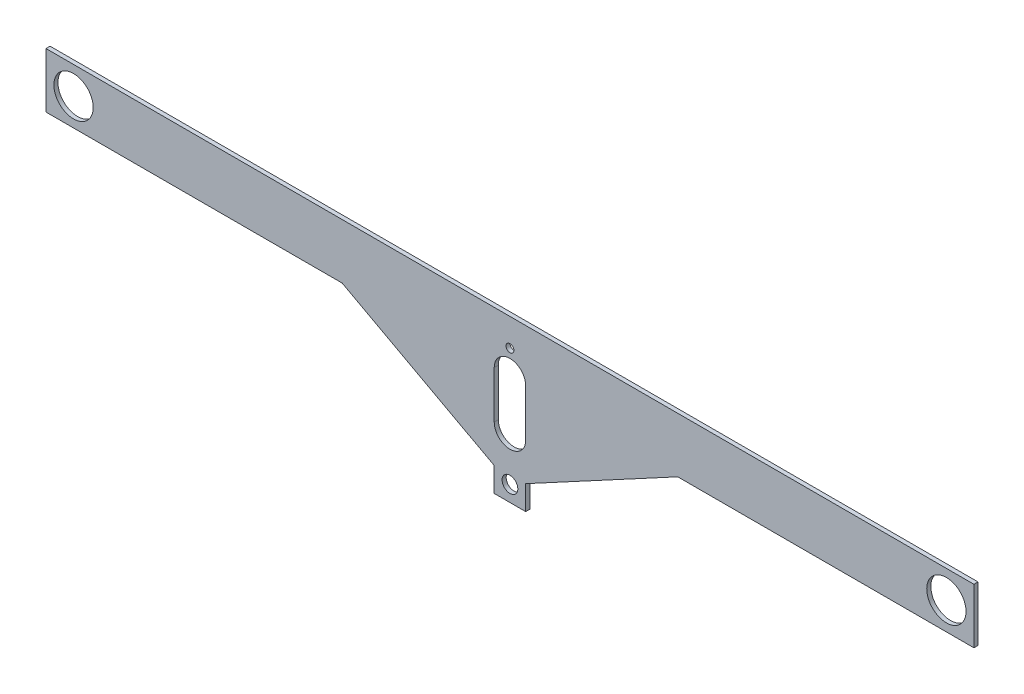
ISO-10303-21;
HEADER;
FILE_DESCRIPTION(('STEP AP214'),'2;1');
FILE_NAME('part.step','',(''),(''),'','','');
FILE_SCHEMA(('AUTOMOTIVE_DESIGN { 1 0 10303 214 1 1 1 1 }'));
ENDSEC;
DATA;
#1=APPLICATION_CONTEXT('core data for automotive mechanical design processes');
#2=APPLICATION_PROTOCOL_DEFINITION('international standard','automotive_design',2000,#1);
#3=PRODUCT_CONTEXT('',#1,'mechanical');
#4=PRODUCT('Part','Part','',(#3));
#5=PRODUCT_RELATED_PRODUCT_CATEGORY('part','',(#4));
#6=PRODUCT_DEFINITION_FORMATION('','',#4);
#7=PRODUCT_DEFINITION_CONTEXT('part definition',#1,'design');
#8=PRODUCT_DEFINITION('design','',#6,#7);
#9=PRODUCT_DEFINITION_SHAPE('','',#8);
#10=(LENGTH_UNIT() NAMED_UNIT(*) SI_UNIT(.MILLI.,.METRE.));
#11=(NAMED_UNIT(*) PLANE_ANGLE_UNIT() SI_UNIT($,.RADIAN.));
#12=(NAMED_UNIT(*) SI_UNIT($,.STERADIAN.) SOLID_ANGLE_UNIT());
#13=UNCERTAINTY_MEASURE_WITH_UNIT(LENGTH_MEASURE(1.E-05),#10,'distance_accuracy_value','');
#14=(GEOMETRIC_REPRESENTATION_CONTEXT(3) GLOBAL_UNCERTAINTY_ASSIGNED_CONTEXT((#13)) GLOBAL_UNIT_ASSIGNED_CONTEXT((#10,
#11,#12)) REPRESENTATION_CONTEXT('',''));
#15=CARTESIAN_POINT('',(0.,0.,0.));
#16=DIRECTION('',(0.,0.,1.));
#17=DIRECTION('',(1.,0.,0.));
#18=AXIS2_PLACEMENT_3D('',#15,#16,#17);
#19=CARTESIAN_POINT('',(0.,0.,3.302));
#20=DIRECTION('',(0.,0.,1.));
#21=DIRECTION('',(1.,0.,0.));
#22=AXIS2_PLACEMENT_3D('',#19,#20,#21);
#23=PLANE('',#22);
#24=DIRECTION('',(0.,1.,0.));
#25=VECTOR('',#24,1.);
#26=CARTESIAN_POINT('',(-749.3,0.,3.302));
#27=LINE('',#26,#25);
#28=CARTESIAN_POINT('',(-749.3,0.,3.302));
#29=VERTEX_POINT('',#28);
#30=CARTESIAN_POINT('',(-749.3,-44.45,3.302));
#31=VERTEX_POINT('',#30);
#32=EDGE_CURVE('E209',#29,#31,#27,.F.);
#33=ORIENTED_EDGE('',*,*,#32,.T.);
#34=DIRECTION('',(1.,0.,0.));
#35=VECTOR('',#34,1.);
#36=CARTESIAN_POINT('',(0.,-44.45,3.302));
#37=LINE('',#36,#35);
#38=CARTESIAN_POINT('',(-510.149137508077,-44.45,3.302));
#39=VERTEX_POINT('',#38);
#40=EDGE_CURVE('E214',#31,#39,#37,.T.);
#41=ORIENTED_EDGE('',*,*,#40,.T.);
#42=DIRECTION('',(0.880297678556178,-0.474421750269318,0.));
#43=VECTOR('',#42,1.);
#44=CARTESIAN_POINT('',(-133.386084451786,-247.500162941411,3.302));
#45=LINE('',#44,#43);
#46=CARTESIAN_POINT('',(-387.35,-110.630546839221,3.302));
#47=VERTEX_POINT('',#46);
#48=EDGE_CURVE('E220',#47,#39,#45,.F.);
#49=ORIENTED_EDGE('',*,*,#48,.F.);
#50=DIRECTION('',(0.,1.,0.));
#51=VECTOR('',#50,1.);
#52=CARTESIAN_POINT('',(-387.35,0.,3.302));
#53=LINE('',#52,#51);
#54=CARTESIAN_POINT('',(-387.35,-130.175,3.302));
#55=VERTEX_POINT('',#54);
#56=EDGE_CURVE('E171',#47,#55,#53,.F.);
#57=ORIENTED_EDGE('',*,*,#56,.T.);
#58=DIRECTION('',(1.,0.,0.));
#59=VECTOR('',#58,1.);
#60=CARTESIAN_POINT('',(0.,-130.175,3.302));
#61=LINE('',#60,#59);
#62=CARTESIAN_POINT('',(-361.95,-130.175,3.302));
#63=VERTEX_POINT('',#62);
#64=EDGE_CURVE('E180',#63,#55,#61,.F.);
#65=ORIENTED_EDGE('',*,*,#64,.F.);
#66=DIRECTION('',(0.,1.,0.));
#67=VECTOR('',#66,1.);
#68=CARTESIAN_POINT('',(-361.95,0.,3.302));
#69=LINE('',#68,#67);
#70=CARTESIAN_POINT('',(-361.95,-110.630546839221,3.302));
#71=VERTEX_POINT('',#70);
#72=EDGE_CURVE('E184',#71,#63,#69,.F.);
#73=ORIENTED_EDGE('',*,*,#72,.F.);
#74=DIRECTION('',(-0.880297678556178,-0.474421750269318,0.));
#75=VECTOR('',#74,1.);
#76=CARTESIAN_POINT('',(-35.2633601966764,65.4317684667759,3.302));
#77=LINE('',#76,#75);
#78=CARTESIAN_POINT('',(-239.150862491923,-44.45,3.302));
#79=VERTEX_POINT('',#78);
#80=EDGE_CURVE('E191',#71,#79,#77,.F.);
#81=ORIENTED_EDGE('',*,*,#80,.T.);
#82=DIRECTION('',(1.,0.,0.));
#83=VECTOR('',#82,1.);
#84=CARTESIAN_POINT('',(0.,-44.45,3.302));
#85=LINE('',#84,#83);
#86=CARTESIAN_POINT('',(0.,-44.45,3.302));
#87=VERTEX_POINT('',#86);
#88=EDGE_CURVE('E194',#87,#79,#85,.F.);
#89=ORIENTED_EDGE('',*,*,#88,.F.);
#90=DIRECTION('',(0.,1.,0.));
#91=VECTOR('',#90,1.);
#92=CARTESIAN_POINT('',(0.,0.,3.302));
#93=LINE('',#92,#91);
#94=CARTESIAN_POINT('',(0.,0.,3.302));
#95=VERTEX_POINT('',#94);
#96=EDGE_CURVE('E198',#95,#87,#93,.F.);
#97=ORIENTED_EDGE('',*,*,#96,.F.);
#98=DIRECTION('',(1.,0.,0.));
#99=VECTOR('',#98,1.);
#100=CARTESIAN_POINT('',(0.,0.,3.302));
#101=LINE('',#100,#99);
#102=EDGE_CURVE('E202',#29,#95,#101,.T.);
#103=ORIENTED_EDGE('',*,*,#102,.F.);
#104=EDGE_LOOP('',(#33,#41,#49,#57,#65,#73,#81,#89,#97,#103));
#105=FACE_BOUND('',#104,.T.);
#106=CARTESIAN_POINT('',(-374.65,-117.475,3.302));
#107=DIRECTION('',(0.,0.,-1.));
#108=DIRECTION('',(-1.,0.,0.));
#109=AXIS2_PLACEMENT_3D('',#106,#107,#108);
#110=CIRCLE('',#109,6.35000000000002);
#111=CARTESIAN_POINT('',(-381.,-117.475,3.302));
#112=VERTEX_POINT('',#111);
#113=EDGE_CURVE('E168',#112,#112,#110,.T.);
#114=ORIENTED_EDGE('',*,*,#113,.T.);
#115=EDGE_LOOP('',(#114));
#116=FACE_BOUND('',#115,.T.);
#117=CARTESIAN_POINT('',(-727.075,-22.225,3.302));
#118=DIRECTION('',(0.,0.,-1.));
#119=DIRECTION('',(-1.,0.,0.));
#120=AXIS2_PLACEMENT_3D('',#117,#118,#119);
#121=CIRCLE('',#120,15.875);
#122=CARTESIAN_POINT('',(-742.95,-22.225,3.302));
#123=VERTEX_POINT('',#122);
#124=EDGE_CURVE('E140',#123,#123,#121,.T.);
#125=ORIENTED_EDGE('',*,*,#124,.T.);
#126=EDGE_LOOP('',(#125));
#127=FACE_BOUND('',#126,.T.);
#128=CARTESIAN_POINT('',(-22.225,-22.225,3.302));
#129=DIRECTION('',(0.,0.,-1.));
#130=DIRECTION('',(-1.,0.,0.));
#131=AXIS2_PLACEMENT_3D('',#128,#129,#130);
#132=CIRCLE('',#131,15.875);
#133=CARTESIAN_POINT('',(-38.1,-22.225,3.302));
#134=VERTEX_POINT('',#133);
#135=EDGE_CURVE('E137',#134,#134,#132,.T.);
#136=ORIENTED_EDGE('',*,*,#135,.T.);
#137=EDGE_LOOP('',(#136));
#138=FACE_BOUND('',#137,.T.);
#139=CARTESIAN_POINT('',(-374.65,-80.2197394480539,3.302));
#140=DIRECTION('',(0.,0.,1.));
#141=DIRECTION('',(1.,0.,0.));
#142=AXIS2_PLACEMENT_3D('',#139,#140,#141);
#143=CIRCLE('',#142,12.7);
#144=CARTESIAN_POINT('',(-361.95,-80.2197394480539,3.302));
#145=VERTEX_POINT('',#144);
#146=CARTESIAN_POINT('',(-387.35,-80.2197394480539,3.302));
#147=VERTEX_POINT('',#146);
#148=EDGE_CURVE('E115',#145,#147,#143,.F.);
#149=ORIENTED_EDGE('',*,*,#148,.T.);
#150=DIRECTION('',(0.,1.,0.));
#151=VECTOR('',#150,1.);
#152=CARTESIAN_POINT('',(-387.35,-42.1197394480539,3.302));
#153=LINE('',#152,#151);
#154=CARTESIAN_POINT('',(-387.35,-42.1197394480539,3.302));
#155=VERTEX_POINT('',#154);
#156=EDGE_CURVE('E146',#147,#155,#153,.T.);
#157=ORIENTED_EDGE('',*,*,#156,.T.);
#158=CARTESIAN_POINT('',(-374.65,-42.1197394480539,3.302));
#159=DIRECTION('',(0.,0.,1.));
#160=DIRECTION('',(1.,0.,0.));
#161=AXIS2_PLACEMENT_3D('',#158,#159,#160);
#162=CIRCLE('',#161,12.7);
#163=CARTESIAN_POINT('',(-361.95,-42.1197394480539,3.302));
#164=VERTEX_POINT('',#163);
#165=EDGE_CURVE('E133',#155,#164,#162,.F.);
#166=ORIENTED_EDGE('',*,*,#165,.T.);
#167=DIRECTION('',(0.,1.,0.));
#168=VECTOR('',#167,1.);
#169=CARTESIAN_POINT('',(-361.95,-42.1197394480539,3.302));
#170=LINE('',#169,#168);
#171=EDGE_CURVE('E128',#164,#145,#170,.F.);
#172=ORIENTED_EDGE('',*,*,#171,.T.);
#173=EDGE_LOOP('',(#149,#157,#166,#172));
#174=FACE_BOUND('',#173,.T.);
#175=CARTESIAN_POINT('',(-374.65,-22.225,3.302));
#176=DIRECTION('',(0.,0.,1.));
#177=DIRECTION('',(1.,0.,0.));
#178=AXIS2_PLACEMENT_3D('',#175,#176,#177);
#179=CIRCLE('',#178,3.17499999999998);
#180=CARTESIAN_POINT('',(-371.475,-22.225,3.302));
#181=VERTEX_POINT('',#180);
#182=EDGE_CURVE('E20',#181,#181,#179,.F.);
#183=ORIENTED_EDGE('',*,*,#182,.T.);
#184=EDGE_LOOP('',(#183));
#185=FACE_BOUND('',#184,.T.);
#186=ADVANCED_FACE('F17',(#105,#116,#127,#138,#174,#185),#23,.T.);
#187=CARTESIAN_POINT('',(-374.65,-22.225,0.));
#188=DIRECTION('',(0.,0.,1.));
#189=DIRECTION('',(1.,0.,0.));
#190=AXIS2_PLACEMENT_3D('',#187,#188,#189);
#191=CYLINDRICAL_SURFACE('',#190,3.17499999999998);
#192=CARTESIAN_POINT('',(-374.65,-22.225,0.));
#193=DIRECTION('',(0.,0.,1.));
#194=DIRECTION('',(1.,0.,0.));
#195=AXIS2_PLACEMENT_3D('',#192,#193,#194);
#196=CIRCLE('',#195,3.17499999999998);
#197=CARTESIAN_POINT('',(-371.475,-22.225,0.));
#198=VERTEX_POINT('',#197);
#199=EDGE_CURVE('E165',#198,#198,#196,.F.);
#200=ORIENTED_EDGE('',*,*,#199,.T.);
#201=EDGE_LOOP('',(#200));
#202=FACE_BOUND('',#201,.T.);
#203=ORIENTED_EDGE('',*,*,#182,.F.);
#204=EDGE_LOOP('',(#203));
#205=FACE_BOUND('',#204,.T.);
#206=ADVANCED_FACE('F340',(#202,#205),#191,.F.);
#207=CARTESIAN_POINT('',(-374.65,-80.2197394480539,0.));
#208=DIRECTION('',(0.,0.,1.));
#209=DIRECTION('',(1.,0.,0.));
#210=AXIS2_PLACEMENT_3D('',#207,#208,#209);
#211=CYLINDRICAL_SURFACE('',#210,12.7);
#212=DIRECTION('',(0.,0.,-1.));
#213=VECTOR('',#212,1.);
#214=CARTESIAN_POINT('',(-361.95,-80.2197394480539,0.));
#215=LINE('',#214,#213);
#216=CARTESIAN_POINT('',(-361.95,-80.2197394480539,0.));
#217=VERTEX_POINT('',#216);
#218=EDGE_CURVE('E119',#145,#217,#215,.T.);
#219=ORIENTED_EDGE('',*,*,#218,.T.);
#220=CARTESIAN_POINT('',(-374.65,-80.2197394480539,0.));
#221=DIRECTION('',(0.,0.,1.));
#222=DIRECTION('',(1.,0.,0.));
#223=AXIS2_PLACEMENT_3D('',#220,#221,#222);
#224=CIRCLE('',#223,12.7);
#225=CARTESIAN_POINT('',(-387.35,-80.2197394480539,0.));
#226=VERTEX_POINT('',#225);
#227=EDGE_CURVE('E163',#217,#226,#224,.F.);
#228=ORIENTED_EDGE('',*,*,#227,.T.);
#229=DIRECTION('',(0.,0.,1.));
#230=VECTOR('',#229,1.);
#231=CARTESIAN_POINT('',(-387.35,-80.2197394480539,0.));
#232=LINE('',#231,#230);
#233=EDGE_CURVE('E121',#226,#147,#232,.T.);
#234=ORIENTED_EDGE('',*,*,#233,.T.);
#235=ORIENTED_EDGE('',*,*,#148,.F.);
#236=EDGE_LOOP('',(#219,#228,#234,#235));
#237=FACE_BOUND('',#236,.T.);
#238=ADVANCED_FACE('F117',(#237),#211,.F.);
#239=CARTESIAN_POINT('',(-387.35,-42.1197394480539,0.));
#240=DIRECTION('',(-1.,0.,0.));
#241=DIRECTION('',(0.,0.,1.));
#242=AXIS2_PLACEMENT_3D('',#239,#240,#241);
#243=PLANE('',#242);
#244=ORIENTED_EDGE('',*,*,#233,.F.);
#245=DIRECTION('',(0.,1.,0.));
#246=VECTOR('',#245,1.);
#247=CARTESIAN_POINT('',(-387.35,0.,0.));
#248=LINE('',#247,#246);
#249=CARTESIAN_POINT('',(-387.35,-42.1197394480539,0.));
#250=VERTEX_POINT('',#249);
#251=EDGE_CURVE('E162',#226,#250,#248,.T.);
#252=ORIENTED_EDGE('',*,*,#251,.T.);
#253=DIRECTION('',(0.,0.,1.));
#254=VECTOR('',#253,1.);
#255=CARTESIAN_POINT('',(-387.35,-42.1197394480539,0.));
#256=LINE('',#255,#254);
#257=EDGE_CURVE('E148',#250,#155,#256,.T.);
#258=ORIENTED_EDGE('',*,*,#257,.T.);
#259=ORIENTED_EDGE('',*,*,#156,.F.);
#260=EDGE_LOOP('',(#244,#252,#258,#259));
#261=FACE_BOUND('',#260,.T.);
#262=ADVANCED_FACE('F335',(#261),#243,.F.);
#263=CARTESIAN_POINT('',(-374.65,-42.1197394480539,0.));
#264=DIRECTION('',(0.,0.,1.));
#265=DIRECTION('',(1.,0.,0.));
#266=AXIS2_PLACEMENT_3D('',#263,#264,#265);
#267=CYLINDRICAL_SURFACE('',#266,12.7);
#268=ORIENTED_EDGE('',*,*,#257,.F.);
#269=CARTESIAN_POINT('',(-374.65,-42.1197394480539,0.));
#270=DIRECTION('',(0.,0.,1.));
#271=DIRECTION('',(1.,0.,0.));
#272=AXIS2_PLACEMENT_3D('',#269,#270,#271);
#273=CIRCLE('',#272,12.7);
#274=CARTESIAN_POINT('',(-361.95,-42.1197394480539,0.));
#275=VERTEX_POINT('',#274);
#276=EDGE_CURVE('E159',#250,#275,#273,.F.);
#277=ORIENTED_EDGE('',*,*,#276,.T.);
#278=DIRECTION('',(0.,0.,-1.));
#279=VECTOR('',#278,1.);
#280=CARTESIAN_POINT('',(-361.95,-42.1197394480539,0.));
#281=LINE('',#280,#279);
#282=EDGE_CURVE('E132',#275,#164,#281,.F.);
#283=ORIENTED_EDGE('',*,*,#282,.T.);
#284=ORIENTED_EDGE('',*,*,#165,.F.);
#285=EDGE_LOOP('',(#268,#277,#283,#284));
#286=FACE_BOUND('',#285,.T.);
#287=ADVANCED_FACE('F332',(#286),#267,.F.);
#288=CARTESIAN_POINT('',(-361.95,-42.1197394480539,0.));
#289=DIRECTION('',(1.,0.,0.));
#290=DIRECTION('',(0.,0.,-1.));
#291=AXIS2_PLACEMENT_3D('',#288,#289,#290);
#292=PLANE('',#291);
#293=ORIENTED_EDGE('',*,*,#282,.F.);
#294=DIRECTION('',(0.,1.,0.));
#295=VECTOR('',#294,1.);
#296=CARTESIAN_POINT('',(-361.95,0.,0.));
#297=LINE('',#296,#295);
#298=EDGE_CURVE('E131',#275,#217,#297,.F.);
#299=ORIENTED_EDGE('',*,*,#298,.T.);
#300=ORIENTED_EDGE('',*,*,#218,.F.);
#301=ORIENTED_EDGE('',*,*,#171,.F.);
#302=EDGE_LOOP('',(#293,#299,#300,#301));
#303=FACE_BOUND('',#302,.T.);
#304=ADVANCED_FACE('F127',(#303),#292,.F.);
#305=CARTESIAN_POINT('',(-22.225,-22.225,3.302));
#306=DIRECTION('',(0.,0.,-1.));
#307=DIRECTION('',(-1.,0.,0.));
#308=AXIS2_PLACEMENT_3D('',#305,#306,#307);
#309=CYLINDRICAL_SURFACE('',#308,15.875);
#310=CARTESIAN_POINT('',(-22.225,-22.225,0.));
#311=DIRECTION('',(0.,0.,-1.));
#312=DIRECTION('',(-1.,0.,0.));
#313=AXIS2_PLACEMENT_3D('',#310,#311,#312);
#314=CIRCLE('',#313,15.875);
#315=CARTESIAN_POINT('',(-38.1,-22.225,0.));
#316=VERTEX_POINT('',#315);
#317=EDGE_CURVE('E156',#316,#316,#314,.T.);
#318=ORIENTED_EDGE('',*,*,#317,.T.);
#319=EDGE_LOOP('',(#318));
#320=FACE_BOUND('',#319,.T.);
#321=ORIENTED_EDGE('',*,*,#135,.F.);
#322=EDGE_LOOP('',(#321));
#323=FACE_BOUND('',#322,.T.);
#324=ADVANCED_FACE('F325',(#320,#323),#309,.F.);
#325=CARTESIAN_POINT('',(-727.075,-22.225,3.302));
#326=DIRECTION('',(0.,0.,-1.));
#327=DIRECTION('',(-1.,0.,0.));
#328=AXIS2_PLACEMENT_3D('',#325,#326,#327);
#329=CYLINDRICAL_SURFACE('',#328,15.875);
#330=CARTESIAN_POINT('',(-727.075,-22.225,0.));
#331=DIRECTION('',(0.,0.,-1.));
#332=DIRECTION('',(-1.,0.,0.));
#333=AXIS2_PLACEMENT_3D('',#330,#331,#332);
#334=CIRCLE('',#333,15.875);
#335=CARTESIAN_POINT('',(-742.95,-22.225,0.));
#336=VERTEX_POINT('',#335);
#337=EDGE_CURVE('E153',#336,#336,#334,.T.);
#338=ORIENTED_EDGE('',*,*,#337,.T.);
#339=EDGE_LOOP('',(#338));
#340=FACE_BOUND('',#339,.T.);
#341=ORIENTED_EDGE('',*,*,#124,.F.);
#342=EDGE_LOOP('',(#341));
#343=FACE_BOUND('',#342,.T.);
#344=ADVANCED_FACE('F321',(#340,#343),#329,.F.);
#345=CARTESIAN_POINT('',(-374.65,-117.475,3.302));
#346=DIRECTION('',(0.,0.,-1.));
#347=DIRECTION('',(-1.,0.,0.));
#348=AXIS2_PLACEMENT_3D('',#345,#346,#347);
#349=CYLINDRICAL_SURFACE('',#348,6.35000000000002);
#350=CARTESIAN_POINT('',(-374.65,-117.475,0.));
#351=DIRECTION('',(0.,0.,-1.));
#352=DIRECTION('',(-1.,0.,0.));
#353=AXIS2_PLACEMENT_3D('',#350,#351,#352);
#354=CIRCLE('',#353,6.35000000000002);
#355=CARTESIAN_POINT('',(-381.,-117.475,0.));
#356=VERTEX_POINT('',#355);
#357=EDGE_CURVE('E149',#356,#356,#354,.T.);
#358=ORIENTED_EDGE('',*,*,#357,.T.);
#359=EDGE_LOOP('',(#358));
#360=FACE_BOUND('',#359,.T.);
#361=ORIENTED_EDGE('',*,*,#113,.F.);
#362=EDGE_LOOP('',(#361));
#363=FACE_BOUND('',#362,.T.);
#364=ADVANCED_FACE('F318',(#360,#363),#349,.F.);
#365=CARTESIAN_POINT('',(-387.35,0.,3.302));
#366=DIRECTION('',(1.,0.,0.));
#367=DIRECTION('',(0.,0.,-1.));
#368=AXIS2_PLACEMENT_3D('',#365,#366,#367);
#369=PLANE('',#368);
#370=DIRECTION('',(0.,0.,-1.));
#371=VECTOR('',#370,1.);
#372=CARTESIAN_POINT('',(-387.35,-130.175,3.302));
#373=LINE('',#372,#371);
#374=CARTESIAN_POINT('',(-387.35,-130.175,0.));
#375=VERTEX_POINT('',#374);
#376=EDGE_CURVE('E182',#55,#375,#373,.T.);
#377=ORIENTED_EDGE('',*,*,#376,.F.);
#378=ORIENTED_EDGE('',*,*,#56,.F.);
#379=DIRECTION('',(0.,0.,1.));
#380=VECTOR('',#379,1.);
#381=CARTESIAN_POINT('',(-387.35,-110.630546839221,3.302));
#382=LINE('',#381,#380);
#383=CARTESIAN_POINT('',(-387.35,-110.630546839221,0.));
#384=VERTEX_POINT('',#383);
#385=EDGE_CURVE('E217',#384,#47,#382,.T.);
#386=ORIENTED_EDGE('',*,*,#385,.F.);
#387=DIRECTION('',(0.,1.,0.));
#388=VECTOR('',#387,1.);
#389=CARTESIAN_POINT('',(-387.35,0.,0.));
#390=LINE('',#389,#388);
#391=EDGE_CURVE('E152',#384,#375,#390,.F.);
#392=ORIENTED_EDGE('',*,*,#391,.T.);
#393=EDGE_LOOP('',(#377,#378,#386,#392));
#394=FACE_BOUND('',#393,.T.);
#395=ADVANCED_FACE('F288',(#394),#369,.F.);
#396=CARTESIAN_POINT('',(0.,-130.175,3.302));
#397=DIRECTION('',(0.,-1.,0.));
#398=DIRECTION('',(0.,0.,-1.));
#399=AXIS2_PLACEMENT_3D('',#396,#397,#398);
#400=PLANE('',#399);
#401=ORIENTED_EDGE('',*,*,#64,.T.);
#402=ORIENTED_EDGE('',*,*,#376,.T.);
#403=DIRECTION('',(1.,0.,0.));
#404=VECTOR('',#403,1.);
#405=CARTESIAN_POINT('',(0.,-130.175,0.));
#406=LINE('',#405,#404);
#407=CARTESIAN_POINT('',(-361.95,-130.175,0.));
#408=VERTEX_POINT('',#407);
#409=EDGE_CURVE('E227',#375,#408,#406,.T.);
#410=ORIENTED_EDGE('',*,*,#409,.T.);
#411=DIRECTION('',(0.,0.,-1.));
#412=VECTOR('',#411,1.);
#413=CARTESIAN_POINT('',(-361.95,-130.175,3.302));
#414=LINE('',#413,#412);
#415=EDGE_CURVE('E186',#63,#408,#414,.T.);
#416=ORIENTED_EDGE('',*,*,#415,.F.);
#417=EDGE_LOOP('',(#401,#402,#410,#416));
#418=FACE_BOUND('',#417,.T.);
#419=ADVANCED_FACE('F285',(#418),#400,.T.);
#420=CARTESIAN_POINT('',(-361.95,0.,3.302));
#421=DIRECTION('',(1.,0.,0.));
#422=DIRECTION('',(0.,0.,-1.));
#423=AXIS2_PLACEMENT_3D('',#420,#421,#422);
#424=PLANE('',#423);
#425=ORIENTED_EDGE('',*,*,#72,.T.);
#426=ORIENTED_EDGE('',*,*,#415,.T.);
#427=DIRECTION('',(0.,1.,0.));
#428=VECTOR('',#427,1.);
#429=CARTESIAN_POINT('',(-361.95,0.,0.));
#430=LINE('',#429,#428);
#431=CARTESIAN_POINT('',(-361.95,-110.630546839221,0.));
#432=VERTEX_POINT('',#431);
#433=EDGE_CURVE('E230',#408,#432,#430,.T.);
#434=ORIENTED_EDGE('',*,*,#433,.T.);
#435=DIRECTION('',(0.,0.,1.));
#436=VECTOR('',#435,1.);
#437=CARTESIAN_POINT('',(-361.95,-110.630546839221,3.302));
#438=LINE('',#437,#436);
#439=EDGE_CURVE('E188',#432,#71,#438,.T.);
#440=ORIENTED_EDGE('',*,*,#439,.T.);
#441=EDGE_LOOP('',(#425,#426,#434,#440));
#442=FACE_BOUND('',#441,.T.);
#443=ADVANCED_FACE('F280',(#442),#424,.T.);
#444=CARTESIAN_POINT('',(-35.2633601966764,65.4317684667759,3.302));
#445=DIRECTION('',(-0.474421750269318,0.880297678556178,0.));
#446=DIRECTION('',(-0.880297678556178,-0.474421750269318,0.));
#447=AXIS2_PLACEMENT_3D('',#444,#445,#446);
#448=PLANE('',#447);
#449=DIRECTION('',(0.,0.,-1.));
#450=VECTOR('',#449,1.);
#451=CARTESIAN_POINT('',(-239.150862491923,-44.45,3.302));
#452=LINE('',#451,#450);
#453=CARTESIAN_POINT('',(-239.150862491923,-44.45,0.));
#454=VERTEX_POINT('',#453);
#455=EDGE_CURVE('E196',#79,#454,#452,.T.);
#456=ORIENTED_EDGE('',*,*,#455,.F.);
#457=ORIENTED_EDGE('',*,*,#80,.F.);
#458=ORIENTED_EDGE('',*,*,#439,.F.);
#459=DIRECTION('',(0.880297678556178,0.474421750269318,0.));
#460=VECTOR('',#459,1.);
#461=CARTESIAN_POINT('',(-361.95,-110.630546839221,0.));
#462=LINE('',#461,#460);
#463=EDGE_CURVE('E233',#432,#454,#462,.T.);
#464=ORIENTED_EDGE('',*,*,#463,.T.);
#465=EDGE_LOOP('',(#456,#457,#458,#464));
#466=FACE_BOUND('',#465,.T.);
#467=ADVANCED_FACE('F277',(#466),#448,.F.);
#468=CARTESIAN_POINT('',(0.,-44.45,3.302));
#469=DIRECTION('',(0.,-1.,0.));
#470=DIRECTION('',(0.,0.,-1.));
#471=AXIS2_PLACEMENT_3D('',#468,#469,#470);
#472=PLANE('',#471);
#473=ORIENTED_EDGE('',*,*,#88,.T.);
#474=ORIENTED_EDGE('',*,*,#455,.T.);
#475=DIRECTION('',(1.,0.,0.));
#476=VECTOR('',#475,1.);
#477=CARTESIAN_POINT('',(0.,-44.45,0.));
#478=LINE('',#477,#476);
#479=CARTESIAN_POINT('',(0.,-44.45,0.));
#480=VERTEX_POINT('',#479);
#481=EDGE_CURVE('E236',#454,#480,#478,.T.);
#482=ORIENTED_EDGE('',*,*,#481,.T.);
#483=DIRECTION('',(0.,0.,-1.));
#484=VECTOR('',#483,1.);
#485=CARTESIAN_POINT('',(0.,-44.45,3.302));
#486=LINE('',#485,#484);
#487=EDGE_CURVE('E200',#87,#480,#486,.T.);
#488=ORIENTED_EDGE('',*,*,#487,.F.);
#489=EDGE_LOOP('',(#473,#474,#482,#488));
#490=FACE_BOUND('',#489,.T.);
#491=ADVANCED_FACE('F272',(#490),#472,.T.);
#492=CARTESIAN_POINT('',(0.,0.,3.302));
#493=DIRECTION('',(1.,0.,0.));
#494=DIRECTION('',(0.,0.,-1.));
#495=AXIS2_PLACEMENT_3D('',#492,#493,#494);
#496=PLANE('',#495);
#497=ORIENTED_EDGE('',*,*,#96,.T.);
#498=ORIENTED_EDGE('',*,*,#487,.T.);
#499=DIRECTION('',(0.,1.,0.));
#500=VECTOR('',#499,1.);
#501=CARTESIAN_POINT('',(0.,0.,0.));
#502=LINE('',#501,#500);
#503=CARTESIAN_POINT('',(0.,0.,0.));
#504=VERTEX_POINT('',#503);
#505=EDGE_CURVE('E239',#480,#504,#502,.T.);
#506=ORIENTED_EDGE('',*,*,#505,.T.);
#507=DIRECTION('',(0.,0.,1.));
#508=VECTOR('',#507,1.);
#509=CARTESIAN_POINT('',(0.,0.,3.302));
#510=LINE('',#509,#508);
#511=EDGE_CURVE('E204',#95,#504,#510,.F.);
#512=ORIENTED_EDGE('',*,*,#511,.F.);
#513=EDGE_LOOP('',(#497,#498,#506,#512));
#514=FACE_BOUND('',#513,.T.);
#515=ADVANCED_FACE('F268',(#514),#496,.T.);
#516=CARTESIAN_POINT('',(0.,0.,3.302));
#517=DIRECTION('',(0.,1.,0.));
#518=DIRECTION('',(0.,0.,1.));
#519=AXIS2_PLACEMENT_3D('',#516,#517,#518);
#520=PLANE('',#519);
#521=ORIENTED_EDGE('',*,*,#102,.T.);
#522=ORIENTED_EDGE('',*,*,#511,.T.);
#523=DIRECTION('',(1.,0.,0.));
#524=VECTOR('',#523,1.);
#525=CARTESIAN_POINT('',(0.,0.,0.));
#526=LINE('',#525,#524);
#527=CARTESIAN_POINT('',(-749.3,0.,0.));
#528=VERTEX_POINT('',#527);
#529=EDGE_CURVE('E242',#504,#528,#526,.F.);
#530=ORIENTED_EDGE('',*,*,#529,.T.);
#531=DIRECTION('',(0.,0.,-1.));
#532=VECTOR('',#531,1.);
#533=CARTESIAN_POINT('',(-749.3,0.,3.302));
#534=LINE('',#533,#532);
#535=EDGE_CURVE('E206',#528,#29,#534,.F.);
#536=ORIENTED_EDGE('',*,*,#535,.T.);
#537=EDGE_LOOP('',(#521,#522,#530,#536));
#538=FACE_BOUND('',#537,.T.);
#539=ADVANCED_FACE('F262',(#538),#520,.T.);
#540=CARTESIAN_POINT('',(-749.3,0.,3.302));
#541=DIRECTION('',(1.,0.,0.));
#542=DIRECTION('',(0.,0.,-1.));
#543=AXIS2_PLACEMENT_3D('',#540,#541,#542);
#544=PLANE('',#543);
#545=DIRECTION('',(0.,0.,1.));
#546=VECTOR('',#545,1.);
#547=CARTESIAN_POINT('',(-749.3,-44.45,3.302));
#548=LINE('',#547,#546);
#549=CARTESIAN_POINT('',(-749.3,-44.45,0.));
#550=VERTEX_POINT('',#549);
#551=EDGE_CURVE('E211',#550,#31,#548,.T.);
#552=ORIENTED_EDGE('',*,*,#551,.T.);
#553=ORIENTED_EDGE('',*,*,#32,.F.);
#554=ORIENTED_EDGE('',*,*,#535,.F.);
#555=DIRECTION('',(0.,1.,0.));
#556=VECTOR('',#555,1.);
#557=CARTESIAN_POINT('',(-749.3,0.,0.));
#558=LINE('',#557,#556);
#559=EDGE_CURVE('E245',#528,#550,#558,.F.);
#560=ORIENTED_EDGE('',*,*,#559,.T.);
#561=EDGE_LOOP('',(#552,#553,#554,#560));
#562=FACE_BOUND('',#561,.T.);
#563=ADVANCED_FACE('F259',(#562),#544,.F.);
#564=CARTESIAN_POINT('',(0.,-44.45,3.302));
#565=DIRECTION('',(0.,1.,0.));
#566=DIRECTION('',(0.,0.,1.));
#567=AXIS2_PLACEMENT_3D('',#564,#565,#566);
#568=PLANE('',#567);
#569=DIRECTION('',(0.,0.,1.));
#570=VECTOR('',#569,1.);
#571=CARTESIAN_POINT('',(-510.149137508077,-44.4499999999999,3.302));
#572=LINE('',#571,#570);
#573=CARTESIAN_POINT('',(-510.149137508077,-44.45,0.));
#574=VERTEX_POINT('',#573);
#575=EDGE_CURVE('E34',#39,#574,#572,.F.);
#576=ORIENTED_EDGE('',*,*,#575,.F.);
#577=ORIENTED_EDGE('',*,*,#40,.F.);
#578=ORIENTED_EDGE('',*,*,#551,.F.);
#579=DIRECTION('',(1.,0.,0.));
#580=VECTOR('',#579,1.);
#581=CARTESIAN_POINT('',(0.,-44.45,0.));
#582=LINE('',#581,#580);
#583=EDGE_CURVE('E26',#550,#574,#582,.T.);
#584=ORIENTED_EDGE('',*,*,#583,.T.);
#585=EDGE_LOOP('',(#576,#577,#578,#584));
#586=FACE_BOUND('',#585,.T.);
#587=ADVANCED_FACE('F251',(#586),#568,.F.);
#588=CARTESIAN_POINT('',(-133.386084451786,-247.500162941411,3.302));
#589=DIRECTION('',(-0.474421750269318,-0.880297678556178,0.));
#590=DIRECTION('',(0.880297678556178,-0.474421750269318,0.));
#591=AXIS2_PLACEMENT_3D('',#588,#589,#590);
#592=PLANE('',#591);
#593=ORIENTED_EDGE('',*,*,#48,.T.);
#594=ORIENTED_EDGE('',*,*,#575,.T.);
#595=DIRECTION('',(0.880297678556178,-0.474421750269318,0.));
#596=VECTOR('',#595,1.);
#597=CARTESIAN_POINT('',(-510.149137508077,-44.45,0.));
#598=LINE('',#597,#596);
#599=EDGE_CURVE('E11',#574,#384,#598,.T.);
#600=ORIENTED_EDGE('',*,*,#599,.T.);
#601=ORIENTED_EDGE('',*,*,#385,.T.);
#602=EDGE_LOOP('',(#593,#594,#600,#601));
#603=FACE_BOUND('',#602,.T.);
#604=ADVANCED_FACE('F291',(#603),#592,.T.);
#605=CARTESIAN_POINT('',(0.,0.,0.));
#606=DIRECTION('',(0.,0.,1.));
#607=DIRECTION('',(1.,0.,0.));
#608=AXIS2_PLACEMENT_3D('',#605,#606,#607);
#609=PLANE('',#608);
#610=ORIENTED_EDGE('',*,*,#583,.F.);
#611=ORIENTED_EDGE('',*,*,#559,.F.);
#612=ORIENTED_EDGE('',*,*,#529,.F.);
#613=ORIENTED_EDGE('',*,*,#505,.F.);
#614=ORIENTED_EDGE('',*,*,#481,.F.);
#615=ORIENTED_EDGE('',*,*,#463,.F.);
#616=ORIENTED_EDGE('',*,*,#433,.F.);
#617=ORIENTED_EDGE('',*,*,#409,.F.);
#618=ORIENTED_EDGE('',*,*,#391,.F.);
#619=ORIENTED_EDGE('',*,*,#599,.F.);
#620=EDGE_LOOP('',(#610,#611,#612,#613,#614,#615,#616,#617,#618,#619));
#621=FACE_BOUND('',#620,.T.);
#622=ORIENTED_EDGE('',*,*,#357,.F.);
#623=EDGE_LOOP('',(#622));
#624=FACE_BOUND('',#623,.T.);
#625=ORIENTED_EDGE('',*,*,#337,.F.);
#626=EDGE_LOOP('',(#625));
#627=FACE_BOUND('',#626,.T.);
#628=ORIENTED_EDGE('',*,*,#317,.F.);
#629=EDGE_LOOP('',(#628));
#630=FACE_BOUND('',#629,.T.);
#631=ORIENTED_EDGE('',*,*,#276,.F.);
#632=ORIENTED_EDGE('',*,*,#251,.F.);
#633=ORIENTED_EDGE('',*,*,#227,.F.);
#634=ORIENTED_EDGE('',*,*,#298,.F.);
#635=EDGE_LOOP('',(#631,#632,#633,#634));
#636=FACE_BOUND('',#635,.T.);
#637=ORIENTED_EDGE('',*,*,#199,.F.);
#638=EDGE_LOOP('',(#637));
#639=FACE_BOUND('',#638,.T.);
#640=ADVANCED_FACE('F255',(#621,#624,#627,#630,#636,#639),#609,.F.);
#641=CLOSED_SHELL('',(#186,#206,#238,#262,#287,#304,#324,#344,#364,#395,#419,#443,#467,#491,
#515,#539,#563,#587,#604,#640));
#642=MANIFOLD_SOLID_BREP('B1',#641);
#643=ADVANCED_BREP_SHAPE_REPRESENTATION('',(#18,#642),#14);
#644=SHAPE_DEFINITION_REPRESENTATION(#9,#643);
ENDSEC;
END-ISO-10303-21;
